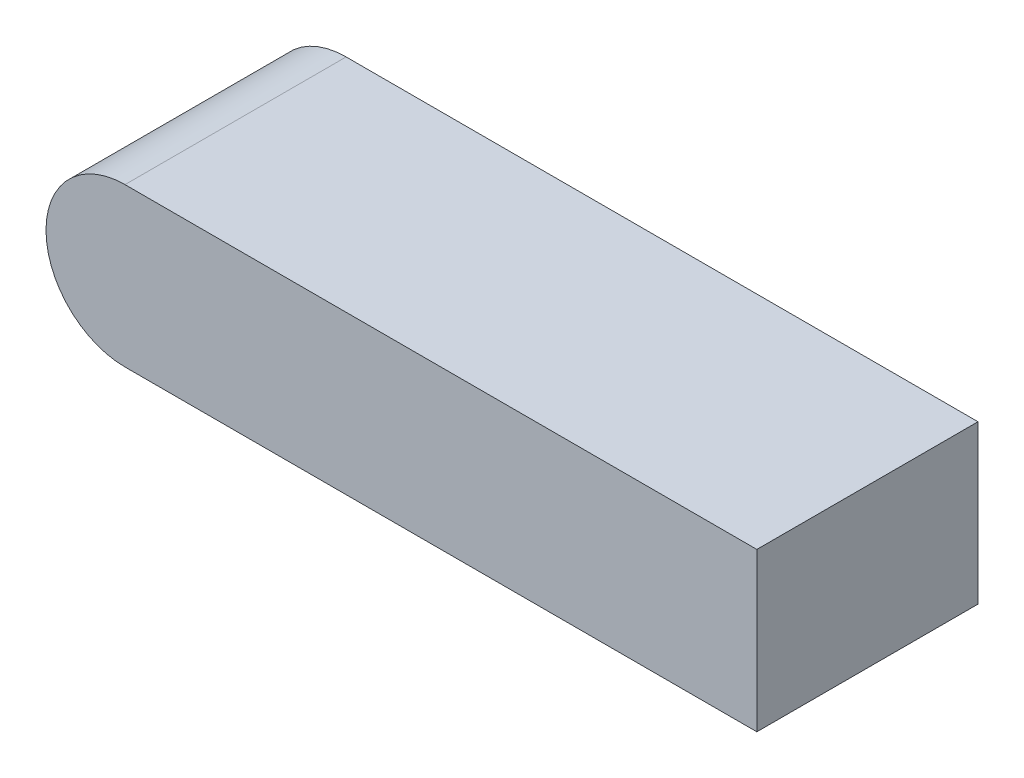
ISO-10303-21;
HEADER;
FILE_DESCRIPTION(('STEP AP214'),'2;1');
FILE_NAME('part.step','',(''),(''),'','','');
FILE_SCHEMA(('AUTOMOTIVE_DESIGN { 1 0 10303 214 1 1 1 1 }'));
ENDSEC;
DATA;
#1=APPLICATION_CONTEXT('core data for automotive mechanical design processes');
#2=APPLICATION_PROTOCOL_DEFINITION('international standard','automotive_design',2000,#1);
#3=PRODUCT_CONTEXT('',#1,'mechanical');
#4=PRODUCT('Part','Part','',(#3));
#5=PRODUCT_RELATED_PRODUCT_CATEGORY('part','',(#4));
#6=PRODUCT_DEFINITION_FORMATION('','',#4);
#7=PRODUCT_DEFINITION_CONTEXT('part definition',#1,'design');
#8=PRODUCT_DEFINITION('design','',#6,#7);
#9=PRODUCT_DEFINITION_SHAPE('','',#8);
#10=(LENGTH_UNIT() NAMED_UNIT(*) SI_UNIT(.MILLI.,.METRE.));
#11=(NAMED_UNIT(*) PLANE_ANGLE_UNIT() SI_UNIT($,.RADIAN.));
#12=(NAMED_UNIT(*) SI_UNIT($,.STERADIAN.) SOLID_ANGLE_UNIT());
#13=UNCERTAINTY_MEASURE_WITH_UNIT(LENGTH_MEASURE(1.E-05),#10,'distance_accuracy_value','');
#14=(GEOMETRIC_REPRESENTATION_CONTEXT(3) GLOBAL_UNCERTAINTY_ASSIGNED_CONTEXT((#13)) GLOBAL_UNIT_ASSIGNED_CONTEXT((#10,
#11,#12)) REPRESENTATION_CONTEXT('',''));
#15=CARTESIAN_POINT('',(0.,0.,0.));
#16=DIRECTION('',(0.,0.,1.));
#17=DIRECTION('',(1.,0.,0.));
#18=AXIS2_PLACEMENT_3D('',#15,#16,#17);
#19=CARTESIAN_POINT('',(50.,-12.5,35.));
#20=DIRECTION('',(-1.,0.,0.));
#21=DIRECTION('',(0.,0.,1.));
#22=AXIS2_PLACEMENT_3D('',#19,#20,#21);
#23=PLANE('',#22);
#24=DIRECTION('',(0.,1.,0.));
#25=VECTOR('',#24,1.);
#26=CARTESIAN_POINT('',(50.,-12.5,0.));
#27=LINE('',#26,#25);
#28=CARTESIAN_POINT('',(50.,-12.5,0.));
#29=VERTEX_POINT('',#28);
#30=CARTESIAN_POINT('',(50.,12.5,0.));
#31=VERTEX_POINT('',#30);
#32=EDGE_CURVE('E96',#29,#31,#27,.T.);
#33=ORIENTED_EDGE('',*,*,#32,.T.);
#34=DIRECTION('',(0.,0.,-1.));
#35=VECTOR('',#34,1.);
#36=CARTESIAN_POINT('',(50.,12.5,35.));
#37=LINE('',#36,#35);
#38=CARTESIAN_POINT('',(50.,12.5,35.));
#39=VERTEX_POINT('',#38);
#40=EDGE_CURVE('E11',#39,#31,#37,.T.);
#41=ORIENTED_EDGE('',*,*,#40,.F.);
#42=DIRECTION('',(0.,1.,0.));
#43=VECTOR('',#42,1.);
#44=CARTESIAN_POINT('',(50.,-12.5,35.));
#45=LINE('',#44,#43);
#46=CARTESIAN_POINT('',(50.,-12.5,35.));
#47=VERTEX_POINT('',#46);
#48=EDGE_CURVE('E84',#47,#39,#45,.T.);
#49=ORIENTED_EDGE('',*,*,#48,.F.);
#50=DIRECTION('',(0.,0.,-1.));
#51=VECTOR('',#50,1.);
#52=CARTESIAN_POINT('',(50.,-12.5,35.));
#53=LINE('',#52,#51);
#54=EDGE_CURVE('E92',#47,#29,#53,.T.);
#55=ORIENTED_EDGE('',*,*,#54,.T.);
#56=EDGE_LOOP('',(#33,#41,#49,#55));
#57=FACE_BOUND('',#56,.T.);
#58=ADVANCED_FACE('F33',(#57),#23,.F.);
#59=CARTESIAN_POINT('',(-50.,12.5,35.));
#60=DIRECTION('',(0.,-1.,0.));
#61=DIRECTION('',(0.,0.,-1.));
#62=AXIS2_PLACEMENT_3D('',#59,#60,#61);
#63=PLANE('',#62);
#64=DIRECTION('',(-1.,0.,0.));
#65=VECTOR('',#64,1.);
#66=CARTESIAN_POINT('',(-50.,12.5,0.));
#67=LINE('',#66,#65);
#68=CARTESIAN_POINT('',(-50.,12.5,0.));
#69=VERTEX_POINT('',#68);
#70=EDGE_CURVE('E88',#31,#69,#67,.T.);
#71=ORIENTED_EDGE('',*,*,#70,.T.);
#72=DIRECTION('',(0.,0.,-1.));
#73=VECTOR('',#72,1.);
#74=CARTESIAN_POINT('',(-50.,12.5,35.));
#75=LINE('',#74,#73);
#76=CARTESIAN_POINT('',(-50.,12.5,35.));
#77=VERTEX_POINT('',#76);
#78=EDGE_CURVE('E41',#77,#69,#75,.T.);
#79=ORIENTED_EDGE('',*,*,#78,.F.);
#80=DIRECTION('',(-1.,0.,0.));
#81=VECTOR('',#80,1.);
#82=CARTESIAN_POINT('',(-50.,12.5,35.));
#83=LINE('',#82,#81);
#84=EDGE_CURVE('E79',#39,#77,#83,.T.);
#85=ORIENTED_EDGE('',*,*,#84,.F.);
#86=ORIENTED_EDGE('',*,*,#40,.T.);
#87=EDGE_LOOP('',(#71,#79,#85,#86));
#88=FACE_BOUND('',#87,.T.);
#89=ADVANCED_FACE('F87',(#88),#63,.F.);
#90=CARTESIAN_POINT('',(-50.,0.,35.));
#91=DIRECTION('',(0.,0.,-1.));
#92=DIRECTION('',(-1.,0.,0.));
#93=AXIS2_PLACEMENT_3D('',#90,#91,#92);
#94=CYLINDRICAL_SURFACE('',#93,12.5);
#95=CARTESIAN_POINT('',(-50.,0.,0.));
#96=DIRECTION('',(0.,0.,1.));
#97=DIRECTION('',(1.,0.,0.));
#98=AXIS2_PLACEMENT_3D('',#95,#96,#97);
#99=CIRCLE('',#98,12.5);
#100=CARTESIAN_POINT('',(-50.,-12.5,0.));
#101=VERTEX_POINT('',#100);
#102=EDGE_CURVE('E66',#69,#101,#99,.T.);
#103=ORIENTED_EDGE('',*,*,#102,.T.);
#104=DIRECTION('',(0.,0.,-1.));
#105=VECTOR('',#104,1.);
#106=CARTESIAN_POINT('',(-50.,-12.5,35.));
#107=LINE('',#106,#105);
#108=CARTESIAN_POINT('',(-50.,-12.5,35.));
#109=VERTEX_POINT('',#108);
#110=EDGE_CURVE('E89',#109,#101,#107,.T.);
#111=ORIENTED_EDGE('',*,*,#110,.F.);
#112=CARTESIAN_POINT('',(-50.,0.,35.));
#113=DIRECTION('',(0.,0.,1.));
#114=DIRECTION('',(1.,0.,0.));
#115=AXIS2_PLACEMENT_3D('',#112,#113,#114);
#116=CIRCLE('',#115,12.5);
#117=EDGE_CURVE('E82',#77,#109,#116,.T.);
#118=ORIENTED_EDGE('',*,*,#117,.F.);
#119=ORIENTED_EDGE('',*,*,#78,.T.);
#120=EDGE_LOOP('',(#103,#111,#118,#119));
#121=FACE_BOUND('',#120,.T.);
#122=ADVANCED_FACE('F90',(#121),#94,.T.);
#123=CARTESIAN_POINT('',(-50.,-12.5,35.));
#124=DIRECTION('',(0.,1.,0.));
#125=DIRECTION('',(0.,0.,1.));
#126=AXIS2_PLACEMENT_3D('',#123,#124,#125);
#127=PLANE('',#126);
#128=DIRECTION('',(1.,0.,0.));
#129=VECTOR('',#128,1.);
#130=CARTESIAN_POINT('',(-50.,-12.5,0.));
#131=LINE('',#130,#129);
#132=EDGE_CURVE('E72',#101,#29,#131,.T.);
#133=ORIENTED_EDGE('',*,*,#132,.T.);
#134=ORIENTED_EDGE('',*,*,#54,.F.);
#135=DIRECTION('',(1.,0.,0.));
#136=VECTOR('',#135,1.);
#137=CARTESIAN_POINT('',(-50.,-12.5,35.));
#138=LINE('',#137,#136);
#139=EDGE_CURVE('E49',#109,#47,#138,.T.);
#140=ORIENTED_EDGE('',*,*,#139,.F.);
#141=ORIENTED_EDGE('',*,*,#110,.T.);
#142=EDGE_LOOP('',(#133,#134,#140,#141));
#143=FACE_BOUND('',#142,.T.);
#144=ADVANCED_FACE('F103',(#143),#127,.F.);
#145=CARTESIAN_POINT('',(-50.,0.,35.));
#146=DIRECTION('',(0.,0.,1.));
#147=DIRECTION('',(1.,0.,0.));
#148=AXIS2_PLACEMENT_3D('',#145,#146,#147);
#149=PLANE('',#148);
#150=ORIENTED_EDGE('',*,*,#48,.T.);
#151=ORIENTED_EDGE('',*,*,#84,.T.);
#152=ORIENTED_EDGE('',*,*,#117,.T.);
#153=ORIENTED_EDGE('',*,*,#139,.T.);
#154=EDGE_LOOP('',(#150,#151,#152,#153));
#155=FACE_BOUND('',#154,.T.);
#156=ADVANCED_FACE('F80',(#155),#149,.T.);
#157=CARTESIAN_POINT('',(-50.,0.,0.));
#158=DIRECTION('',(0.,0.,1.));
#159=DIRECTION('',(1.,0.,0.));
#160=AXIS2_PLACEMENT_3D('',#157,#158,#159);
#161=PLANE('',#160);
#162=ORIENTED_EDGE('',*,*,#32,.F.);
#163=ORIENTED_EDGE('',*,*,#132,.F.);
#164=ORIENTED_EDGE('',*,*,#102,.F.);
#165=ORIENTED_EDGE('',*,*,#70,.F.);
#166=EDGE_LOOP('',(#162,#163,#164,#165));
#167=FACE_BOUND('',#166,.T.);
#168=ADVANCED_FACE('F106',(#167),#161,.F.);
#169=CLOSED_SHELL('',(#58,#89,#122,#144,#156,#168));
#170=MANIFOLD_SOLID_BREP('B2',#169);
#171=ADVANCED_BREP_SHAPE_REPRESENTATION('',(#18,#170),#14);
#172=SHAPE_DEFINITION_REPRESENTATION(#9,#171);
ENDSEC;
END-ISO-10303-21;
